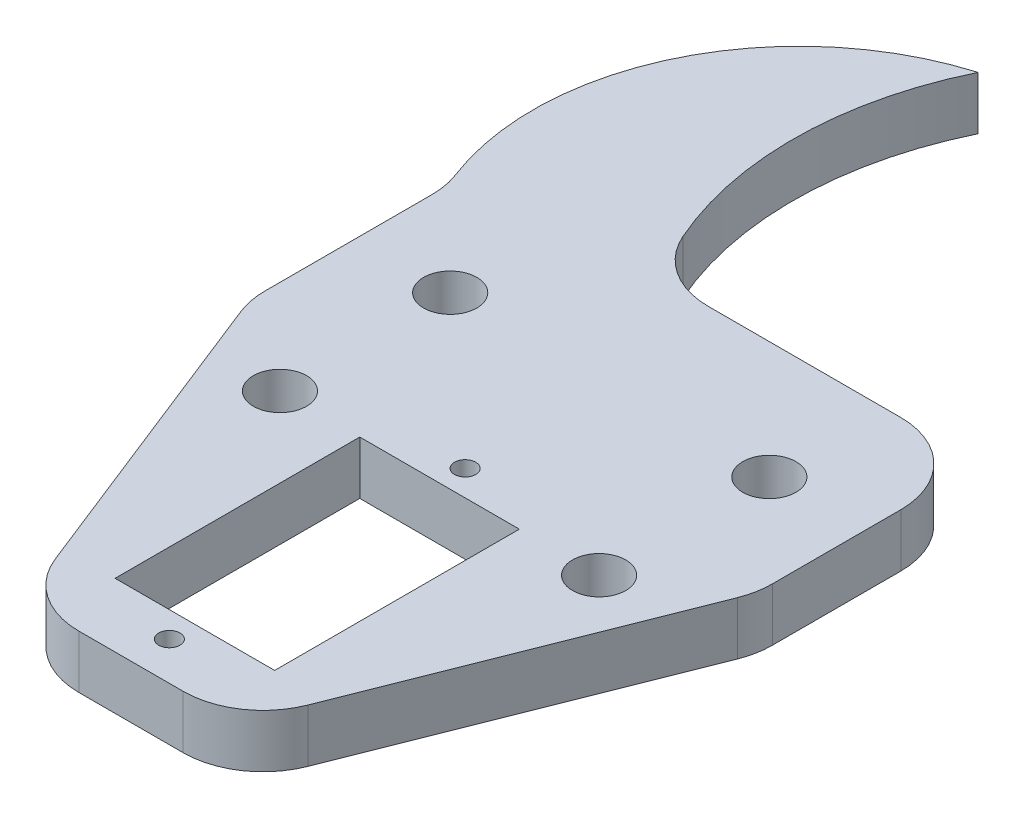
ISO-10303-21;
HEADER;
FILE_DESCRIPTION(('STEP AP214'),'2;1');
FILE_NAME('part.step','',(''),(''),'','','');
FILE_SCHEMA(('AUTOMOTIVE_DESIGN { 1 0 10303 214 1 1 1 1 }'));
ENDSEC;
DATA;
#1=APPLICATION_CONTEXT('core data for automotive mechanical design processes');
#2=APPLICATION_PROTOCOL_DEFINITION('international standard','automotive_design',2000,#1);
#3=PRODUCT_CONTEXT('',#1,'mechanical');
#4=PRODUCT('Part','Part','',(#3));
#5=PRODUCT_RELATED_PRODUCT_CATEGORY('part','',(#4));
#6=PRODUCT_DEFINITION_FORMATION('','',#4);
#7=PRODUCT_DEFINITION_CONTEXT('part definition',#1,'design');
#8=PRODUCT_DEFINITION('design','',#6,#7);
#9=PRODUCT_DEFINITION_SHAPE('','',#8);
#10=(LENGTH_UNIT() NAMED_UNIT(*) SI_UNIT(.MILLI.,.METRE.));
#11=(NAMED_UNIT(*) PLANE_ANGLE_UNIT() SI_UNIT($,.RADIAN.));
#12=(NAMED_UNIT(*) SI_UNIT($,.STERADIAN.) SOLID_ANGLE_UNIT());
#13=UNCERTAINTY_MEASURE_WITH_UNIT(LENGTH_MEASURE(1.E-05),#10,'distance_accuracy_value','');
#14=(GEOMETRIC_REPRESENTATION_CONTEXT(3) GLOBAL_UNCERTAINTY_ASSIGNED_CONTEXT((#13)) GLOBAL_UNIT_ASSIGNED_CONTEXT((#10,
#11,#12)) REPRESENTATION_CONTEXT('',''));
#15=CARTESIAN_POINT('',(0.,0.,0.));
#16=DIRECTION('',(0.,0.,1.));
#17=DIRECTION('',(1.,0.,0.));
#18=AXIS2_PLACEMENT_3D('',#15,#16,#17);
#19=CARTESIAN_POINT('',(0.,5.,0.));
#20=DIRECTION('',(0.,-1.,0.));
#21=DIRECTION('',(0.,0.,-1.));
#22=AXIS2_PLACEMENT_3D('',#19,#20,#21);
#23=CYLINDRICAL_SURFACE('',#22,25.);
#24=CARTESIAN_POINT('',(0.,0.,0.));
#25=DIRECTION('',(0.,1.,0.));
#26=DIRECTION('',(0.,0.,1.));
#27=AXIS2_PLACEMENT_3D('',#24,#25,#26);
#28=CIRCLE('',#27,25.);
#29=CARTESIAN_POINT('',(-7.13363436512248,0.,-23.9606189557938));
#30=VERTEX_POINT('',#29);
#31=CARTESIAN_POINT('',(-23.3458130599936,0.,8.94276313942358));
#32=VERTEX_POINT('',#31);
#33=EDGE_CURVE('E245',#30,#32,#28,.T.);
#34=ORIENTED_EDGE('',*,*,#33,.T.);
#35=DIRECTION('',(0.,-1.,0.));
#36=VECTOR('',#35,1.);
#37=CARTESIAN_POINT('',(-23.3458130599936,5.,8.94276313942358));
#38=LINE('',#37,#36);
#39=CARTESIAN_POINT('',(-23.3458130599936,5.,8.94276313942358));
#40=VERTEX_POINT('',#39);
#41=EDGE_CURVE('E249',#32,#40,#38,.F.);
#42=ORIENTED_EDGE('',*,*,#41,.T.);
#43=CARTESIAN_POINT('',(0.,5.,0.));
#44=DIRECTION('',(0.,1.,0.));
#45=DIRECTION('',(0.,0.,1.));
#46=AXIS2_PLACEMENT_3D('',#43,#44,#45);
#47=CIRCLE('',#46,25.);
#48=CARTESIAN_POINT('',(-7.13363436512248,5.,-23.9606189557938));
#49=VERTEX_POINT('',#48);
#50=EDGE_CURVE('E246',#49,#40,#47,.T.);
#51=ORIENTED_EDGE('',*,*,#50,.F.);
#52=DIRECTION('',(0.,1.,0.));
#53=VECTOR('',#52,1.);
#54=CARTESIAN_POINT('',(-7.13363436512248,0.,-23.9606189557938));
#55=LINE('',#54,#53);
#56=EDGE_CURVE('E241',#30,#49,#55,.T.);
#57=ORIENTED_EDGE('',*,*,#56,.F.);
#58=EDGE_LOOP('',(#34,#42,#51,#57));
#59=FACE_BOUND('',#58,.T.);
#60=ADVANCED_FACE('F36',(#59),#23,.T.);
#61=CARTESIAN_POINT('',(22.0649112171784,0.,-9.7955162808368));
#62=DIRECTION('',(0.,1.,0.));
#63=DIRECTION('',(0.,0.,1.));
#64=AXIS2_PLACEMENT_3D('',#61,#62,#63);
#65=CYLINDRICAL_SURFACE('',#64,32.4531230841313);
#66=CARTESIAN_POINT('',(22.0649112171784,5.,-9.7955162808368));
#67=DIRECTION('',(0.,1.,0.));
#68=DIRECTION('',(0.,0.,1.));
#69=AXIS2_PLACEMENT_3D('',#66,#67,#68);
#70=CIRCLE('',#69,32.4531230841313);
#71=CARTESIAN_POINT('',(-7.63456201807516,5.,3.28678043886165));
#72=VERTEX_POINT('',#71);
#73=EDGE_CURVE('E230',#49,#72,#70,.T.);
#74=ORIENTED_EDGE('',*,*,#73,.T.);
#75=DIRECTION('',(0.,1.,0.));
#76=VECTOR('',#75,1.);
#77=CARTESIAN_POINT('',(-7.63456201807516,0.,3.28678043886166));
#78=LINE('',#77,#76);
#79=CARTESIAN_POINT('',(-7.63456201807516,0.,3.28678043886165));
#80=VERTEX_POINT('',#79);
#81=EDGE_CURVE('E302',#72,#80,#78,.F.);
#82=ORIENTED_EDGE('',*,*,#81,.T.);
#83=CARTESIAN_POINT('',(22.0649112171784,0.,-9.7955162808368));
#84=DIRECTION('',(0.,1.,0.));
#85=DIRECTION('',(0.,0.,1.));
#86=AXIS2_PLACEMENT_3D('',#83,#84,#85);
#87=CIRCLE('',#86,32.4531230841313);
#88=EDGE_CURVE('E238',#30,#80,#87,.T.);
#89=ORIENTED_EDGE('',*,*,#88,.F.);
#90=ORIENTED_EDGE('',*,*,#56,.T.);
#91=EDGE_LOOP('',(#74,#82,#89,#90));
#92=FACE_BOUND('',#91,.T.);
#93=ADVANCED_FACE('F318',(#92),#65,.F.);
#94=CARTESIAN_POINT('',(0.,5.,0.));
#95=DIRECTION('',(0.,1.,0.));
#96=DIRECTION('',(0.,0.,1.));
#97=AXIS2_PLACEMENT_3D('',#94,#95,#96);
#98=PLANE('',#97);
#99=CARTESIAN_POINT('',(-14.0045438182928,5.,34.7824208251933));
#100=DIRECTION('',(0.,1.,0.));
#101=DIRECTION('',(0.,0.,-1.));
#102=AXIS2_PLACEMENT_3D('',#99,#100,#101);
#103=CIRCLE('',#102,2.5);
#104=CARTESIAN_POINT('',(-14.0045438182928,5.,32.2824208251933));
#105=VERTEX_POINT('',#104);
#106=EDGE_CURVE('E658',#105,#105,#103,.T.);
#107=ORIENTED_EDGE('',*,*,#106,.F.);
#108=EDGE_LOOP('',(#107));
#109=FACE_BOUND('',#108,.T.);
#110=CARTESIAN_POINT('',(15.9954561817072,5.,18.7824208251933));
#111=DIRECTION('',(0.,1.,0.));
#112=DIRECTION('',(0.,0.,-1.));
#113=AXIS2_PLACEMENT_3D('',#110,#111,#112);
#114=CIRCLE('',#113,2.5);
#115=CARTESIAN_POINT('',(15.9954561817072,5.,16.2824208251933));
#116=VERTEX_POINT('',#115);
#117=EDGE_CURVE('E670',#116,#116,#114,.T.);
#118=ORIENTED_EDGE('',*,*,#117,.F.);
#119=EDGE_LOOP('',(#118));
#120=FACE_BOUND('',#119,.T.);
#121=CARTESIAN_POINT('',(-14.0045438182928,5.,18.7824208251933));
#122=DIRECTION('',(0.,1.,0.));
#123=DIRECTION('',(0.,0.,1.));
#124=AXIS2_PLACEMENT_3D('',#121,#122,#123);
#125=CIRCLE('',#124,2.5);
#126=CARTESIAN_POINT('',(-14.0045438182928,5.,21.2824208251933));
#127=VERTEX_POINT('',#126);
#128=EDGE_CURVE('E665',#127,#127,#125,.T.);
#129=ORIENTED_EDGE('',*,*,#128,.F.);
#130=EDGE_LOOP('',(#129));
#131=FACE_BOUND('',#130,.T.);
#132=CARTESIAN_POINT('',(15.9954561817072,5.,34.7824208251933));
#133=DIRECTION('',(0.,1.,0.));
#134=DIRECTION('',(0.,0.,1.));
#135=AXIS2_PLACEMENT_3D('',#132,#133,#134);
#136=CIRCLE('',#135,2.5);
#137=CARTESIAN_POINT('',(15.9954561817072,5.,37.2824208251933));
#138=VERTEX_POINT('',#137);
#139=EDGE_CURVE('E357',#138,#138,#136,.T.);
#140=ORIENTED_EDGE('',*,*,#139,.F.);
#141=EDGE_LOOP('',(#140));
#142=FACE_BOUND('',#141,.T.);
#143=DIRECTION('',(0.,0.,-1.));
#144=VECTOR('',#143,1.);
#145=CARTESIAN_POINT('',(-22.8495569779917,5.,0.));
#146=LINE('',#145,#144);
#147=CARTESIAN_POINT('',(-22.8495569779917,5.,27.3529161886198));
#148=VERTEX_POINT('',#147);
#149=CARTESIAN_POINT('',(-22.8495569779917,5.,11.6255920812507));
#150=VERTEX_POINT('',#149);
#151=EDGE_CURVE('E217',#148,#150,#146,.T.);
#152=ORIENTED_EDGE('',*,*,#151,.F.);
#153=CARTESIAN_POINT('',(-15.3495569779917,5.,27.3529161886198));
#154=DIRECTION('',(0.,1.,0.));
#155=DIRECTION('',(0.,0.,1.));
#156=AXIS2_PLACEMENT_3D('',#153,#154,#155);
#157=CIRCLE('',#156,7.5);
#158=CARTESIAN_POINT('',(-22.3237305777452,5.,30.1117026248088));
#159=VERTEX_POINT('',#158);
#160=EDGE_CURVE('E267',#148,#159,#157,.T.);
#161=ORIENTED_EDGE('',*,*,#160,.T.);
#162=DIRECTION('',(0.367838191491859,0.,0.929889813300478));
#163=VECTOR('',#162,1.);
#164=CARTESIAN_POINT('',(-29.6028970463062,5.,11.7100714048949));
#165=LINE('',#164,#163);
#166=CARTESIAN_POINT('',(-10.8800342235473,5.,59.0412072613822));
#167=VERTEX_POINT('',#166);
#168=EDGE_CURVE('E348',#159,#167,#165,.T.);
#169=ORIENTED_EDGE('',*,*,#168,.T.);
#170=CARTESIAN_POINT('',(-3.90586062379368,5.,56.2824208251933));
#171=DIRECTION('',(0.,1.,0.));
#172=DIRECTION('',(0.,0.,1.));
#173=AXIS2_PLACEMENT_3D('',#170,#171,#172);
#174=CIRCLE('',#173,7.5);
#175=CARTESIAN_POINT('',(-3.90586062379368,5.,63.7824208251933));
#176=VERTEX_POINT('',#175);
#177=EDGE_CURVE('E263',#167,#176,#174,.T.);
#178=ORIENTED_EDGE('',*,*,#177,.T.);
#179=DIRECTION('',(1.,0.,0.));
#180=VECTOR('',#179,1.);
#181=CARTESIAN_POINT('',(-9.00454381829278,5.,63.7824208251933));
#182=LINE('',#181,#180);
#183=CARTESIAN_POINT('',(5.89677298720811,5.,63.7824208251933));
#184=VERTEX_POINT('',#183);
#185=EDGE_CURVE('E211',#176,#184,#182,.T.);
#186=ORIENTED_EDGE('',*,*,#185,.T.);
#187=CARTESIAN_POINT('',(5.89677298720811,5.,56.2824208251933));
#188=DIRECTION('',(0.,1.,0.));
#189=DIRECTION('',(0.,0.,1.));
#190=AXIS2_PLACEMENT_3D('',#187,#188,#189);
#191=CIRCLE('',#190,7.5);
#192=CARTESIAN_POINT('',(12.8709465869617,5.,59.0412072613822));
#193=VERTEX_POINT('',#192);
#194=EDGE_CURVE('E265',#184,#193,#191,.T.);
#195=ORIENTED_EDGE('',*,*,#194,.T.);
#196=DIRECTION('',(0.367838191491859,0.,-0.929889813300479));
#197=VECTOR('',#196,1.);
#198=CARTESIAN_POINT('',(31.3244291415592,5.,12.3910609624269));
#199=LINE('',#198,#197);
#200=CARTESIAN_POINT('',(24.3146429411597,5.,30.1117026248087));
#201=VERTEX_POINT('',#200);
#202=EDGE_CURVE('E349',#193,#201,#199,.T.);
#203=ORIENTED_EDGE('',*,*,#202,.T.);
#204=CARTESIAN_POINT('',(17.3404693414061,5.,27.3529161886198));
#205=DIRECTION('',(0.,1.,0.));
#206=DIRECTION('',(0.,0.,1.));
#207=AXIS2_PLACEMENT_3D('',#204,#205,#206);
#208=CIRCLE('',#207,7.5);
#209=CARTESIAN_POINT('',(24.8404693414061,5.,27.3529161886198));
#210=VERTEX_POINT('',#209);
#211=EDGE_CURVE('E261',#201,#210,#208,.T.);
#212=ORIENTED_EDGE('',*,*,#211,.T.);
#213=DIRECTION('',(0.,0.,1.));
#214=VECTOR('',#213,1.);
#215=CARTESIAN_POINT('',(24.8404693414061,5.,0.));
#216=LINE('',#215,#214);
#217=CARTESIAN_POINT('',(24.8404693414061,5.,15.2634281056092));
#218=VERTEX_POINT('',#217);
#219=EDGE_CURVE('E233',#218,#210,#216,.T.);
#220=ORIENTED_EDGE('',*,*,#219,.F.);
#221=CARTESIAN_POINT('',(17.3404693414061,5.,15.2634281056092));
#222=DIRECTION('',(0.,1.,0.));
#223=DIRECTION('',(0.,0.,1.));
#224=AXIS2_PLACEMENT_3D('',#221,#222,#223);
#225=CIRCLE('',#224,7.5);
#226=CARTESIAN_POINT('',(17.3404693414061,5.,7.76342810560916));
#227=VERTEX_POINT('',#226);
#228=EDGE_CURVE('E259',#218,#227,#225,.T.);
#229=ORIENTED_EDGE('',*,*,#228,.T.);
#230=DIRECTION('',(1.,0.,0.));
#231=VECTOR('',#230,1.);
#232=CARTESIAN_POINT('',(0.,5.,7.76342810560917));
#233=LINE('',#232,#231);
#234=CARTESIAN_POINT('',(-0.770937562365419,5.,7.76342810560917));
#235=VERTEX_POINT('',#234);
#236=EDGE_CURVE('E224',#235,#227,#233,.T.);
#237=ORIENTED_EDGE('',*,*,#236,.F.);
#238=CARTESIAN_POINT('',(-0.770937562365421,5.,0.263428105609169));
#239=DIRECTION('',(0.,1.,0.));
#240=DIRECTION('',(0.,0.,1.));
#241=AXIS2_PLACEMENT_3D('',#238,#239,#240);
#242=CIRCLE('',#241,7.5);
#243=EDGE_CURVE('E44',#235,#72,#242,.F.);
#244=ORIENTED_EDGE('',*,*,#243,.T.);
#245=ORIENTED_EDGE('',*,*,#73,.F.);
#246=ORIENTED_EDGE('',*,*,#50,.T.);
#247=CARTESIAN_POINT('',(-30.3495569779917,5.,11.6255920812507));
#248=DIRECTION('',(0.,1.,0.));
#249=DIRECTION('',(0.,0.,1.));
#250=AXIS2_PLACEMENT_3D('',#247,#248,#249);
#251=CIRCLE('',#250,7.5);
#252=EDGE_CURVE('E304',#40,#150,#251,.F.);
#253=ORIENTED_EDGE('',*,*,#252,.T.);
#254=EDGE_LOOP('',(#152,#161,#169,#178,#186,#195,#203,#212,#220,#229,#237,#244,#245,#246,#253));
#255=FACE_BOUND('',#254,.T.);
#256=CARTESIAN_POINT('',(0.995456181707223,5.,32.3824208251933));
#257=DIRECTION('',(0.,1.,0.));
#258=DIRECTION('',(0.,0.,-1.));
#259=AXIS2_PLACEMENT_3D('',#256,#257,#258);
#260=CIRCLE('',#259,1.);
#261=CARTESIAN_POINT('',(0.995456181707223,5.,31.3824208251933));
#262=VERTEX_POINT('',#261);
#263=EDGE_CURVE('E361',#262,#262,#260,.T.);
#264=ORIENTED_EDGE('',*,*,#263,.F.);
#265=EDGE_LOOP('',(#264));
#266=FACE_BOUND('',#265,.T.);
#267=CARTESIAN_POINT('',(0.995456181707223,5.,60.1824208251933));
#268=DIRECTION('',(0.,1.,0.));
#269=DIRECTION('',(0.,0.,1.));
#270=AXIS2_PLACEMENT_3D('',#267,#268,#269);
#271=CIRCLE('',#270,1.);
#272=CARTESIAN_POINT('',(0.995456181707223,5.,61.1824208251933));
#273=VERTEX_POINT('',#272);
#274=EDGE_CURVE('E198',#273,#273,#271,.T.);
#275=ORIENTED_EDGE('',*,*,#274,.F.);
#276=EDGE_LOOP('',(#275));
#277=FACE_BOUND('',#276,.T.);
#278=DIRECTION('',(-1.,0.,0.));
#279=VECTOR('',#278,1.);
#280=CARTESIAN_POINT('',(-6.50454381829278,5.,34.7824208251933));
#281=LINE('',#280,#279);
#282=CARTESIAN_POINT('',(8.49545618170722,5.,34.7824208251933));
#283=VERTEX_POINT('',#282);
#284=CARTESIAN_POINT('',(-6.50454381829278,5.,34.7824208251933));
#285=VERTEX_POINT('',#284);
#286=EDGE_CURVE('E204',#283,#285,#281,.T.);
#287=ORIENTED_EDGE('',*,*,#286,.F.);
#288=DIRECTION('',(0.,0.,-1.));
#289=VECTOR('',#288,1.);
#290=CARTESIAN_POINT('',(8.49545618170722,5.,57.7824208251933));
#291=LINE('',#290,#289);
#292=CARTESIAN_POINT('',(8.49545618170722,5.,57.7824208251933));
#293=VERTEX_POINT('',#292);
#294=EDGE_CURVE('E175',#293,#283,#291,.T.);
#295=ORIENTED_EDGE('',*,*,#294,.F.);
#296=DIRECTION('',(1.,0.,0.));
#297=VECTOR('',#296,1.);
#298=CARTESIAN_POINT('',(-6.50454381829278,5.,57.7824208251933));
#299=LINE('',#298,#297);
#300=CARTESIAN_POINT('',(-6.50454381829278,5.,57.7824208251933));
#301=VERTEX_POINT('',#300);
#302=EDGE_CURVE('E192',#301,#293,#299,.T.);
#303=ORIENTED_EDGE('',*,*,#302,.F.);
#304=DIRECTION('',(0.,0.,1.));
#305=VECTOR('',#304,1.);
#306=CARTESIAN_POINT('',(-6.50454381829278,5.,57.7824208251933));
#307=LINE('',#306,#305);
#308=EDGE_CURVE('E195',#285,#301,#307,.T.);
#309=ORIENTED_EDGE('',*,*,#308,.F.);
#310=EDGE_LOOP('',(#287,#295,#303,#309));
#311=FACE_BOUND('',#310,.T.);
#312=ADVANCED_FACE('F311',(#109,#120,#131,#142,#255,#266,#277,#311),#98,.T.);
#313=CARTESIAN_POINT('',(0.,0.,0.));
#314=DIRECTION('',(0.,1.,0.));
#315=DIRECTION('',(0.,0.,1.));
#316=AXIS2_PLACEMENT_3D('',#313,#314,#315);
#317=PLANE('',#316);
#318=CARTESIAN_POINT('',(-14.0045438182928,0.,34.7824208251933));
#319=DIRECTION('',(0.,1.,0.));
#320=DIRECTION('',(0.,0.,-1.));
#321=AXIS2_PLACEMENT_3D('',#318,#319,#320);
#322=CIRCLE('',#321,2.5);
#323=CARTESIAN_POINT('',(-14.0045438182928,0.,32.2824208251933));
#324=VERTEX_POINT('',#323);
#325=EDGE_CURVE('E656',#324,#324,#322,.T.);
#326=ORIENTED_EDGE('',*,*,#325,.T.);
#327=EDGE_LOOP('',(#326));
#328=FACE_BOUND('',#327,.T.);
#329=CARTESIAN_POINT('',(15.9954561817072,0.,18.7824208251933));
#330=DIRECTION('',(0.,1.,0.));
#331=DIRECTION('',(0.,0.,-1.));
#332=AXIS2_PLACEMENT_3D('',#329,#330,#331);
#333=CIRCLE('',#332,2.5);
#334=CARTESIAN_POINT('',(15.9954561817072,0.,16.2824208251933));
#335=VERTEX_POINT('',#334);
#336=EDGE_CURVE('E662',#335,#335,#333,.T.);
#337=ORIENTED_EDGE('',*,*,#336,.T.);
#338=EDGE_LOOP('',(#337));
#339=FACE_BOUND('',#338,.T.);
#340=CARTESIAN_POINT('',(-14.0045438182928,0.,18.7824208251933));
#341=DIRECTION('',(0.,1.,0.));
#342=DIRECTION('',(0.,0.,1.));
#343=AXIS2_PLACEMENT_3D('',#340,#341,#342);
#344=CIRCLE('',#343,2.5);
#345=CARTESIAN_POINT('',(-14.0045438182928,0.,21.2824208251933));
#346=VERTEX_POINT('',#345);
#347=EDGE_CURVE('E672',#346,#346,#344,.T.);
#348=ORIENTED_EDGE('',*,*,#347,.T.);
#349=EDGE_LOOP('',(#348));
#350=FACE_BOUND('',#349,.T.);
#351=CARTESIAN_POINT('',(15.9954561817072,0.,34.7824208251933));
#352=DIRECTION('',(0.,1.,0.));
#353=DIRECTION('',(0.,0.,1.));
#354=AXIS2_PLACEMENT_3D('',#351,#352,#353);
#355=CIRCLE('',#354,2.5);
#356=CARTESIAN_POINT('',(15.9954561817072,0.,37.2824208251933));
#357=VERTEX_POINT('',#356);
#358=EDGE_CURVE('E354',#357,#357,#355,.T.);
#359=ORIENTED_EDGE('',*,*,#358,.T.);
#360=EDGE_LOOP('',(#359));
#361=FACE_BOUND('',#360,.T.);
#362=DIRECTION('',(0.367838191491859,0.,0.929889813300478));
#363=VECTOR('',#362,1.);
#364=CARTESIAN_POINT('',(-29.6028970463062,0.,11.7100714048949));
#365=LINE('',#364,#363);
#366=CARTESIAN_POINT('',(-22.3237305777452,0.,30.1117026248088));
#367=VERTEX_POINT('',#366);
#368=CARTESIAN_POINT('',(-10.8800342235473,0.,59.0412072613822));
#369=VERTEX_POINT('',#368);
#370=EDGE_CURVE('E352',#367,#369,#365,.T.);
#371=ORIENTED_EDGE('',*,*,#370,.F.);
#372=CARTESIAN_POINT('',(-15.3495569779917,0.,27.3529161886198));
#373=DIRECTION('',(0.,1.,0.));
#374=DIRECTION('',(0.,0.,1.));
#375=AXIS2_PLACEMENT_3D('',#372,#373,#374);
#376=CIRCLE('',#375,7.5);
#377=CARTESIAN_POINT('',(-22.8495569779917,0.,27.3529161886198));
#378=VERTEX_POINT('',#377);
#379=EDGE_CURVE('E281',#367,#378,#376,.F.);
#380=ORIENTED_EDGE('',*,*,#379,.T.);
#381=DIRECTION('',(0.,0.,-1.));
#382=VECTOR('',#381,1.);
#383=CARTESIAN_POINT('',(-22.8495569779917,0.,0.));
#384=LINE('',#383,#382);
#385=CARTESIAN_POINT('',(-22.8495569779917,0.,11.6255920812507));
#386=VERTEX_POINT('',#385);
#387=EDGE_CURVE('E220',#378,#386,#384,.T.);
#388=ORIENTED_EDGE('',*,*,#387,.T.);
#389=CARTESIAN_POINT('',(-30.3495569779917,0.,11.6255920812507));
#390=DIRECTION('',(0.,1.,0.));
#391=DIRECTION('',(0.,0.,1.));
#392=AXIS2_PLACEMENT_3D('',#389,#390,#391);
#393=CIRCLE('',#392,7.5);
#394=EDGE_CURVE('E306',#386,#32,#393,.T.);
#395=ORIENTED_EDGE('',*,*,#394,.T.);
#396=ORIENTED_EDGE('',*,*,#33,.F.);
#397=ORIENTED_EDGE('',*,*,#88,.T.);
#398=CARTESIAN_POINT('',(-0.770937562365421,0.,0.263428105609169));
#399=DIRECTION('',(0.,1.,0.));
#400=DIRECTION('',(0.,0.,1.));
#401=AXIS2_PLACEMENT_3D('',#398,#399,#400);
#402=CIRCLE('',#401,7.5);
#403=CARTESIAN_POINT('',(-0.770937562365419,0.,7.76342810560917));
#404=VERTEX_POINT('',#403);
#405=EDGE_CURVE('E11',#80,#404,#402,.T.);
#406=ORIENTED_EDGE('',*,*,#405,.T.);
#407=DIRECTION('',(1.,0.,0.));
#408=VECTOR('',#407,1.);
#409=CARTESIAN_POINT('',(0.,0.,7.76342810560917));
#410=LINE('',#409,#408);
#411=CARTESIAN_POINT('',(17.3404693414061,0.,7.76342810560916));
#412=VERTEX_POINT('',#411);
#413=EDGE_CURVE('E227',#404,#412,#410,.T.);
#414=ORIENTED_EDGE('',*,*,#413,.T.);
#415=CARTESIAN_POINT('',(17.3404693414061,0.,15.2634281056092));
#416=DIRECTION('',(0.,1.,0.));
#417=DIRECTION('',(0.,0.,1.));
#418=AXIS2_PLACEMENT_3D('',#415,#416,#417);
#419=CIRCLE('',#418,7.5);
#420=CARTESIAN_POINT('',(24.8404693414061,0.,15.2634281056092));
#421=VERTEX_POINT('',#420);
#422=EDGE_CURVE('E274',#412,#421,#419,.F.);
#423=ORIENTED_EDGE('',*,*,#422,.T.);
#424=DIRECTION('',(0.,0.,1.));
#425=VECTOR('',#424,1.);
#426=CARTESIAN_POINT('',(24.8404693414061,0.,0.));
#427=LINE('',#426,#425);
#428=CARTESIAN_POINT('',(24.8404693414061,0.,27.3529161886198));
#429=VERTEX_POINT('',#428);
#430=EDGE_CURVE('E223',#421,#429,#427,.T.);
#431=ORIENTED_EDGE('',*,*,#430,.T.);
#432=CARTESIAN_POINT('',(17.3404693414061,0.,27.3529161886198));
#433=DIRECTION('',(0.,1.,0.));
#434=DIRECTION('',(0.,0.,1.));
#435=AXIS2_PLACEMENT_3D('',#432,#433,#434);
#436=CIRCLE('',#435,7.5);
#437=CARTESIAN_POINT('',(24.3146429411597,0.,30.1117026248087));
#438=VERTEX_POINT('',#437);
#439=EDGE_CURVE('E276',#429,#438,#436,.F.);
#440=ORIENTED_EDGE('',*,*,#439,.T.);
#441=DIRECTION('',(0.367838191491859,0.,-0.929889813300479));
#442=VECTOR('',#441,1.);
#443=CARTESIAN_POINT('',(31.3244291415592,0.,12.3910609624269));
#444=LINE('',#443,#442);
#445=CARTESIAN_POINT('',(12.8709465869617,0.,59.0412072613822));
#446=VERTEX_POINT('',#445);
#447=EDGE_CURVE('E342',#446,#438,#444,.T.);
#448=ORIENTED_EDGE('',*,*,#447,.F.);
#449=CARTESIAN_POINT('',(5.89677298720811,0.,56.2824208251933));
#450=DIRECTION('',(0.,1.,0.));
#451=DIRECTION('',(0.,0.,1.));
#452=AXIS2_PLACEMENT_3D('',#449,#450,#451);
#453=CIRCLE('',#452,7.5);
#454=CARTESIAN_POINT('',(5.89677298720811,0.,63.7824208251933));
#455=VERTEX_POINT('',#454);
#456=EDGE_CURVE('E51',#446,#455,#453,.F.);
#457=ORIENTED_EDGE('',*,*,#456,.T.);
#458=DIRECTION('',(1.,0.,0.));
#459=VECTOR('',#458,1.);
#460=CARTESIAN_POINT('',(-9.00454381829278,0.,63.7824208251933));
#461=LINE('',#460,#459);
#462=CARTESIAN_POINT('',(-3.90586062379368,0.,63.7824208251933));
#463=VERTEX_POINT('',#462);
#464=EDGE_CURVE('E215',#463,#455,#461,.T.);
#465=ORIENTED_EDGE('',*,*,#464,.F.);
#466=CARTESIAN_POINT('',(-3.90586062379368,0.,56.2824208251933));
#467=DIRECTION('',(0.,1.,0.));
#468=DIRECTION('',(0.,0.,1.));
#469=AXIS2_PLACEMENT_3D('',#466,#467,#468);
#470=CIRCLE('',#469,7.5);
#471=EDGE_CURVE('E278',#463,#369,#470,.F.);
#472=ORIENTED_EDGE('',*,*,#471,.T.);
#473=EDGE_LOOP('',(#371,#380,#388,#395,#396,#397,#406,#414,#423,#431,#440,#448,#457,#465,#472));
#474=FACE_BOUND('',#473,.T.);
#475=CARTESIAN_POINT('',(0.995456181707223,0.,32.3824208251933));
#476=DIRECTION('',(0.,1.,0.));
#477=DIRECTION('',(0.,0.,-1.));
#478=AXIS2_PLACEMENT_3D('',#475,#476,#477);
#479=CIRCLE('',#478,1.);
#480=CARTESIAN_POINT('',(0.995456181707223,0.,31.3824208251933));
#481=VERTEX_POINT('',#480);
#482=EDGE_CURVE('E363',#481,#481,#479,.T.);
#483=ORIENTED_EDGE('',*,*,#482,.T.);
#484=EDGE_LOOP('',(#483));
#485=FACE_BOUND('',#484,.T.);
#486=CARTESIAN_POINT('',(0.995456181707223,0.,60.1824208251933));
#487=DIRECTION('',(0.,1.,0.));
#488=DIRECTION('',(0.,0.,1.));
#489=AXIS2_PLACEMENT_3D('',#486,#487,#488);
#490=CIRCLE('',#489,1.);
#491=CARTESIAN_POINT('',(0.995456181707223,0.,61.1824208251933));
#492=VERTEX_POINT('',#491);
#493=EDGE_CURVE('E205',#492,#492,#490,.T.);
#494=ORIENTED_EDGE('',*,*,#493,.T.);
#495=EDGE_LOOP('',(#494));
#496=FACE_BOUND('',#495,.T.);
#497=DIRECTION('',(0.,0.,-1.));
#498=VECTOR('',#497,1.);
#499=CARTESIAN_POINT('',(8.49545618170722,0.,57.7824208251933));
#500=LINE('',#499,#498);
#501=CARTESIAN_POINT('',(8.49545618170722,0.,57.7824208251933));
#502=VERTEX_POINT('',#501);
#503=CARTESIAN_POINT('',(8.49545618170722,0.,34.7824208251933));
#504=VERTEX_POINT('',#503);
#505=EDGE_CURVE('E172',#502,#504,#500,.T.);
#506=ORIENTED_EDGE('',*,*,#505,.T.);
#507=DIRECTION('',(-1.,0.,0.));
#508=VECTOR('',#507,1.);
#509=CARTESIAN_POINT('',(-6.50454381829278,0.,34.7824208251933));
#510=LINE('',#509,#508);
#511=CARTESIAN_POINT('',(-6.50454381829278,0.,34.7824208251933));
#512=VERTEX_POINT('',#511);
#513=EDGE_CURVE('E184',#504,#512,#510,.T.);
#514=ORIENTED_EDGE('',*,*,#513,.T.);
#515=DIRECTION('',(0.,0.,1.));
#516=VECTOR('',#515,1.);
#517=CARTESIAN_POINT('',(-6.50454381829278,0.,57.7824208251933));
#518=LINE('',#517,#516);
#519=CARTESIAN_POINT('',(-6.50454381829278,0.,57.7824208251933));
#520=VERTEX_POINT('',#519);
#521=EDGE_CURVE('E188',#512,#520,#518,.T.);
#522=ORIENTED_EDGE('',*,*,#521,.T.);
#523=DIRECTION('',(1.,0.,0.));
#524=VECTOR('',#523,1.);
#525=CARTESIAN_POINT('',(-6.50454381829278,0.,57.7824208251933));
#526=LINE('',#525,#524);
#527=EDGE_CURVE('E180',#520,#502,#526,.T.);
#528=ORIENTED_EDGE('',*,*,#527,.T.);
#529=EDGE_LOOP('',(#506,#514,#522,#528));
#530=FACE_BOUND('',#529,.T.);
#531=ADVANCED_FACE('F190',(#328,#339,#350,#361,#474,#485,#496,#530),#317,.F.);
#532=CARTESIAN_POINT('',(-22.8495569779917,0.,0.));
#533=DIRECTION('',(1.,0.,0.));
#534=DIRECTION('',(0.,0.,-1.));
#535=AXIS2_PLACEMENT_3D('',#532,#533,#534);
#536=PLANE('',#535);
#537=ORIENTED_EDGE('',*,*,#151,.T.);
#538=DIRECTION('',(0.,1.,0.));
#539=VECTOR('',#538,1.);
#540=CARTESIAN_POINT('',(-22.8495569779917,0.,11.6255920812507));
#541=LINE('',#540,#539);
#542=EDGE_CURVE('E257',#150,#386,#541,.F.);
#543=ORIENTED_EDGE('',*,*,#542,.T.);
#544=ORIENTED_EDGE('',*,*,#387,.F.);
#545=DIRECTION('',(0.,1.,0.));
#546=VECTOR('',#545,1.);
#547=CARTESIAN_POINT('',(-22.8495569779917,5.,27.3529161886198));
#548=LINE('',#547,#546);
#549=EDGE_CURVE('E254',#378,#148,#548,.T.);
#550=ORIENTED_EDGE('',*,*,#549,.T.);
#551=EDGE_LOOP('',(#537,#543,#544,#550));
#552=FACE_BOUND('',#551,.T.);
#553=ADVANCED_FACE('F516',(#552),#536,.F.);
#554=CARTESIAN_POINT('',(0.,0.,7.76342810560917));
#555=DIRECTION('',(0.,0.,1.));
#556=DIRECTION('',(1.,0.,0.));
#557=AXIS2_PLACEMENT_3D('',#554,#555,#556);
#558=PLANE('',#557);
#559=ORIENTED_EDGE('',*,*,#236,.T.);
#560=DIRECTION('',(0.,1.,0.));
#561=VECTOR('',#560,1.);
#562=CARTESIAN_POINT('',(17.3404693414061,0.,7.76342810560916));
#563=LINE('',#562,#561);
#564=EDGE_CURVE('E300',#227,#412,#563,.F.);
#565=ORIENTED_EDGE('',*,*,#564,.T.);
#566=ORIENTED_EDGE('',*,*,#413,.F.);
#567=DIRECTION('',(0.,-1.,0.));
#568=VECTOR('',#567,1.);
#569=CARTESIAN_POINT('',(-0.770937562365419,5.,7.76342810560917));
#570=LINE('',#569,#568);
#571=EDGE_CURVE('E297',#404,#235,#570,.F.);
#572=ORIENTED_EDGE('',*,*,#571,.T.);
#573=EDGE_LOOP('',(#559,#565,#566,#572));
#574=FACE_BOUND('',#573,.T.);
#575=ADVANCED_FACE('F327',(#574),#558,.F.);
#576=CARTESIAN_POINT('',(24.8404693414061,0.,0.));
#577=DIRECTION('',(-1.,0.,0.));
#578=DIRECTION('',(0.,0.,1.));
#579=AXIS2_PLACEMENT_3D('',#576,#577,#578);
#580=PLANE('',#579);
#581=ORIENTED_EDGE('',*,*,#219,.T.);
#582=DIRECTION('',(0.,1.,0.));
#583=VECTOR('',#582,1.);
#584=CARTESIAN_POINT('',(24.8404693414061,0.,27.3529161886198));
#585=LINE('',#584,#583);
#586=EDGE_CURVE('E295',#210,#429,#585,.F.);
#587=ORIENTED_EDGE('',*,*,#586,.T.);
#588=ORIENTED_EDGE('',*,*,#430,.F.);
#589=DIRECTION('',(0.,1.,0.));
#590=VECTOR('',#589,1.);
#591=CARTESIAN_POINT('',(24.8404693414061,0.,15.2634281056092));
#592=LINE('',#591,#590);
#593=EDGE_CURVE('E292',#421,#218,#592,.T.);
#594=ORIENTED_EDGE('',*,*,#593,.T.);
#595=EDGE_LOOP('',(#581,#587,#588,#594));
#596=FACE_BOUND('',#595,.T.);
#597=ADVANCED_FACE('F335',(#596),#580,.F.);
#598=CARTESIAN_POINT('',(-9.00454381829278,0.,63.7824208251933));
#599=DIRECTION('',(0.,0.,1.));
#600=DIRECTION('',(1.,0.,0.));
#601=AXIS2_PLACEMENT_3D('',#598,#599,#600);
#602=PLANE('',#601);
#603=ORIENTED_EDGE('',*,*,#464,.T.);
#604=DIRECTION('',(0.,1.,0.));
#605=VECTOR('',#604,1.);
#606=CARTESIAN_POINT('',(5.89677298720811,0.,63.7824208251933));
#607=LINE('',#606,#605);
#608=EDGE_CURVE('E284',#455,#184,#607,.T.);
#609=ORIENTED_EDGE('',*,*,#608,.T.);
#610=ORIENTED_EDGE('',*,*,#185,.F.);
#611=DIRECTION('',(0.,1.,0.));
#612=VECTOR('',#611,1.);
#613=CARTESIAN_POINT('',(-3.90586062379368,0.,63.7824208251933));
#614=LINE('',#613,#612);
#615=EDGE_CURVE('E58',#176,#463,#614,.F.);
#616=ORIENTED_EDGE('',*,*,#615,.T.);
#617=EDGE_LOOP('',(#603,#609,#610,#616));
#618=FACE_BOUND('',#617,.T.);
#619=ADVANCED_FACE('F392',(#618),#602,.T.);
#620=CARTESIAN_POINT('',(8.49545618170722,0.,57.7824208251933));
#621=DIRECTION('',(1.,0.,0.));
#622=DIRECTION('',(0.,0.,-1.));
#623=AXIS2_PLACEMENT_3D('',#620,#621,#622);
#624=PLANE('',#623);
#625=ORIENTED_EDGE('',*,*,#294,.T.);
#626=DIRECTION('',(0.,1.,0.));
#627=VECTOR('',#626,1.);
#628=CARTESIAN_POINT('',(8.49545618170722,0.,34.7824208251933));
#629=LINE('',#628,#627);
#630=EDGE_CURVE('E168',#504,#283,#629,.T.);
#631=ORIENTED_EDGE('',*,*,#630,.F.);
#632=ORIENTED_EDGE('',*,*,#505,.F.);
#633=DIRECTION('',(0.,1.,0.));
#634=VECTOR('',#633,1.);
#635=CARTESIAN_POINT('',(8.49545618170722,0.,57.7824208251933));
#636=LINE('',#635,#634);
#637=EDGE_CURVE('E209',#502,#293,#636,.T.);
#638=ORIENTED_EDGE('',*,*,#637,.T.);
#639=EDGE_LOOP('',(#625,#631,#632,#638));
#640=FACE_BOUND('',#639,.T.);
#641=ADVANCED_FACE('F170',(#640),#624,.F.);
#642=CARTESIAN_POINT('',(-6.50454381829278,0.,57.7824208251933));
#643=DIRECTION('',(0.,0.,1.));
#644=DIRECTION('',(1.,0.,0.));
#645=AXIS2_PLACEMENT_3D('',#642,#643,#644);
#646=PLANE('',#645);
#647=ORIENTED_EDGE('',*,*,#302,.T.);
#648=ORIENTED_EDGE('',*,*,#637,.F.);
#649=ORIENTED_EDGE('',*,*,#527,.F.);
#650=DIRECTION('',(0.,1.,0.));
#651=VECTOR('',#650,1.);
#652=CARTESIAN_POINT('',(-6.50454381829278,0.,57.7824208251933));
#653=LINE('',#652,#651);
#654=EDGE_CURVE('E212',#520,#301,#653,.T.);
#655=ORIENTED_EDGE('',*,*,#654,.T.);
#656=EDGE_LOOP('',(#647,#648,#649,#655));
#657=FACE_BOUND('',#656,.T.);
#658=ADVANCED_FACE('F384',(#657),#646,.F.);
#659=CARTESIAN_POINT('',(-6.50454381829278,0.,57.7824208251933));
#660=DIRECTION('',(-1.,0.,0.));
#661=DIRECTION('',(0.,0.,1.));
#662=AXIS2_PLACEMENT_3D('',#659,#660,#661);
#663=PLANE('',#662);
#664=ORIENTED_EDGE('',*,*,#308,.T.);
#665=ORIENTED_EDGE('',*,*,#654,.F.);
#666=ORIENTED_EDGE('',*,*,#521,.F.);
#667=DIRECTION('',(0.,1.,0.));
#668=VECTOR('',#667,1.);
#669=CARTESIAN_POINT('',(-6.50454381829278,0.,34.7824208251933));
#670=LINE('',#669,#668);
#671=EDGE_CURVE('E179',#512,#285,#670,.T.);
#672=ORIENTED_EDGE('',*,*,#671,.T.);
#673=EDGE_LOOP('',(#664,#665,#666,#672));
#674=FACE_BOUND('',#673,.T.);
#675=ADVANCED_FACE('F382',(#674),#663,.F.);
#676=CARTESIAN_POINT('',(-6.50454381829278,0.,34.7824208251933));
#677=DIRECTION('',(0.,0.,-1.));
#678=DIRECTION('',(-1.,0.,0.));
#679=AXIS2_PLACEMENT_3D('',#676,#677,#678);
#680=PLANE('',#679);
#681=ORIENTED_EDGE('',*,*,#286,.T.);
#682=ORIENTED_EDGE('',*,*,#671,.F.);
#683=ORIENTED_EDGE('',*,*,#513,.F.);
#684=ORIENTED_EDGE('',*,*,#630,.T.);
#685=EDGE_LOOP('',(#681,#682,#683,#684));
#686=FACE_BOUND('',#685,.T.);
#687=ADVANCED_FACE('F185',(#686),#680,.F.);
#688=CARTESIAN_POINT('',(0.995456181707223,0.,60.1824208251933));
#689=DIRECTION('',(0.,1.,0.));
#690=DIRECTION('',(0.,0.,1.));
#691=AXIS2_PLACEMENT_3D('',#688,#689,#690);
#692=CYLINDRICAL_SURFACE('',#691,1.);
#693=ORIENTED_EDGE('',*,*,#493,.F.);
#694=EDGE_LOOP('',(#693));
#695=FACE_BOUND('',#694,.T.);
#696=ORIENTED_EDGE('',*,*,#274,.T.);
#697=EDGE_LOOP('',(#696));
#698=FACE_BOUND('',#697,.T.);
#699=ADVANCED_FACE('F373',(#695,#698),#692,.F.);
#700=CARTESIAN_POINT('',(0.995456181707223,0.,32.3824208251933));
#701=DIRECTION('',(0.,1.,0.));
#702=DIRECTION('',(0.,0.,1.));
#703=AXIS2_PLACEMENT_3D('',#700,#701,#702);
#704=CYLINDRICAL_SURFACE('',#703,1.);
#705=ORIENTED_EDGE('',*,*,#482,.F.);
#706=EDGE_LOOP('',(#705));
#707=FACE_BOUND('',#706,.T.);
#708=ORIENTED_EDGE('',*,*,#263,.T.);
#709=EDGE_LOOP('',(#708));
#710=FACE_BOUND('',#709,.T.);
#711=ADVANCED_FACE('F485',(#707,#710),#704,.F.);
#712=CARTESIAN_POINT('',(-29.6028970463062,0.,11.7100714048949));
#713=DIRECTION('',(-0.929889813300478,0.,0.367838191491859));
#714=DIRECTION('',(0.367838191491859,0.,0.929889813300478));
#715=AXIS2_PLACEMENT_3D('',#712,#713,#714);
#716=PLANE('',#715);
#717=ORIENTED_EDGE('',*,*,#168,.F.);
#718=DIRECTION('',(0.,1.,0.));
#719=VECTOR('',#718,1.);
#720=CARTESIAN_POINT('',(-22.3237305777452,0.,30.1117026248088));
#721=LINE('',#720,#719);
#722=EDGE_CURVE('E272',#159,#367,#721,.F.);
#723=ORIENTED_EDGE('',*,*,#722,.T.);
#724=ORIENTED_EDGE('',*,*,#370,.T.);
#725=DIRECTION('',(0.,1.,0.));
#726=VECTOR('',#725,1.);
#727=CARTESIAN_POINT('',(-10.8800342235473,0.,59.0412072613822));
#728=LINE('',#727,#726);
#729=EDGE_CURVE('E269',#369,#167,#728,.T.);
#730=ORIENTED_EDGE('',*,*,#729,.T.);
#731=EDGE_LOOP('',(#717,#723,#724,#730));
#732=FACE_BOUND('',#731,.T.);
#733=ADVANCED_FACE('F474',(#732),#716,.T.);
#734=CARTESIAN_POINT('',(31.3244291415592,0.,12.3910609624269));
#735=DIRECTION('',(0.929889813300479,0.,0.367838191491859));
#736=DIRECTION('',(0.367838191491859,0.,-0.929889813300479));
#737=AXIS2_PLACEMENT_3D('',#734,#735,#736);
#738=PLANE('',#737);
#739=ORIENTED_EDGE('',*,*,#202,.F.);
#740=DIRECTION('',(0.,1.,0.));
#741=VECTOR('',#740,1.);
#742=CARTESIAN_POINT('',(12.8709465869617,0.,59.0412072613822));
#743=LINE('',#742,#741);
#744=EDGE_CURVE('E290',#193,#446,#743,.F.);
#745=ORIENTED_EDGE('',*,*,#744,.T.);
#746=ORIENTED_EDGE('',*,*,#447,.T.);
#747=DIRECTION('',(0.,1.,0.));
#748=VECTOR('',#747,1.);
#749=CARTESIAN_POINT('',(24.3146429411597,5.,30.1117026248087));
#750=LINE('',#749,#748);
#751=EDGE_CURVE('E287',#438,#201,#750,.T.);
#752=ORIENTED_EDGE('',*,*,#751,.T.);
#753=EDGE_LOOP('',(#739,#745,#746,#752));
#754=FACE_BOUND('',#753,.T.);
#755=ADVANCED_FACE('F345',(#754),#738,.T.);
#756=CARTESIAN_POINT('',(15.9954561817072,0.,34.7824208251933));
#757=DIRECTION('',(0.,1.,0.));
#758=DIRECTION('',(0.,0.,1.));
#759=AXIS2_PLACEMENT_3D('',#756,#757,#758);
#760=CYLINDRICAL_SURFACE('',#759,2.5);
#761=ORIENTED_EDGE('',*,*,#358,.F.);
#762=EDGE_LOOP('',(#761));
#763=FACE_BOUND('',#762,.T.);
#764=ORIENTED_EDGE('',*,*,#139,.T.);
#765=EDGE_LOOP('',(#764));
#766=FACE_BOUND('',#765,.T.);
#767=ADVANCED_FACE('F473',(#763,#766),#760,.F.);
#768=CARTESIAN_POINT('',(-14.0045438182928,0.,18.7824208251933));
#769=DIRECTION('',(0.,1.,0.));
#770=DIRECTION('',(0.,0.,1.));
#771=AXIS2_PLACEMENT_3D('',#768,#769,#770);
#772=CYLINDRICAL_SURFACE('',#771,2.5);
#773=ORIENTED_EDGE('',*,*,#347,.F.);
#774=EDGE_LOOP('',(#773));
#775=FACE_BOUND('',#774,.T.);
#776=ORIENTED_EDGE('',*,*,#128,.T.);
#777=EDGE_LOOP('',(#776));
#778=FACE_BOUND('',#777,.T.);
#779=ADVANCED_FACE('F570',(#775,#778),#772,.F.);
#780=CARTESIAN_POINT('',(15.9954561817072,0.,18.7824208251933));
#781=DIRECTION('',(0.,1.,0.));
#782=DIRECTION('',(0.,0.,1.));
#783=AXIS2_PLACEMENT_3D('',#780,#781,#782);
#784=CYLINDRICAL_SURFACE('',#783,2.5);
#785=ORIENTED_EDGE('',*,*,#336,.F.);
#786=EDGE_LOOP('',(#785));
#787=FACE_BOUND('',#786,.T.);
#788=ORIENTED_EDGE('',*,*,#117,.T.);
#789=EDGE_LOOP('',(#788));
#790=FACE_BOUND('',#789,.T.);
#791=ADVANCED_FACE('F560',(#787,#790),#784,.F.);
#792=CARTESIAN_POINT('',(-14.0045438182928,0.,34.7824208251933));
#793=DIRECTION('',(0.,1.,0.));
#794=DIRECTION('',(0.,0.,1.));
#795=AXIS2_PLACEMENT_3D('',#792,#793,#794);
#796=CYLINDRICAL_SURFACE('',#795,2.5);
#797=ORIENTED_EDGE('',*,*,#325,.F.);
#798=EDGE_LOOP('',(#797));
#799=FACE_BOUND('',#798,.T.);
#800=ORIENTED_EDGE('',*,*,#106,.T.);
#801=EDGE_LOOP('',(#800));
#802=FACE_BOUND('',#801,.T.);
#803=ADVANCED_FACE('F408',(#799,#802),#796,.F.);
#804=CARTESIAN_POINT('',(-30.3495569779917,5.,11.6255920812507));
#805=DIRECTION('',(0.,-1.,0.));
#806=DIRECTION('',(0.,0.,-1.));
#807=AXIS2_PLACEMENT_3D('',#804,#805,#806);
#808=CYLINDRICAL_SURFACE('',#807,7.5);
#809=ORIENTED_EDGE('',*,*,#394,.F.);
#810=ORIENTED_EDGE('',*,*,#542,.F.);
#811=ORIENTED_EDGE('',*,*,#252,.F.);
#812=ORIENTED_EDGE('',*,*,#41,.F.);
#813=EDGE_LOOP('',(#809,#810,#811,#812));
#814=FACE_BOUND('',#813,.T.);
#815=ADVANCED_FACE('F404',(#814),#808,.F.);
#816=CARTESIAN_POINT('',(-15.3495569779917,0.,27.3529161886198));
#817=DIRECTION('',(0.,-1.,0.));
#818=DIRECTION('',(0.,0.,-1.));
#819=AXIS2_PLACEMENT_3D('',#816,#817,#818);
#820=CYLINDRICAL_SURFACE('',#819,7.5);
#821=ORIENTED_EDGE('',*,*,#379,.F.);
#822=ORIENTED_EDGE('',*,*,#722,.F.);
#823=ORIENTED_EDGE('',*,*,#160,.F.);
#824=ORIENTED_EDGE('',*,*,#549,.F.);
#825=EDGE_LOOP('',(#821,#822,#823,#824));
#826=FACE_BOUND('',#825,.T.);
#827=ADVANCED_FACE('F407',(#826),#820,.T.);
#828=CARTESIAN_POINT('',(5.89677298720811,0.,56.2824208251933));
#829=DIRECTION('',(0.,1.,0.));
#830=DIRECTION('',(0.,0.,1.));
#831=AXIS2_PLACEMENT_3D('',#828,#829,#830);
#832=CYLINDRICAL_SURFACE('',#831,7.5);
#833=ORIENTED_EDGE('',*,*,#456,.F.);
#834=ORIENTED_EDGE('',*,*,#744,.F.);
#835=ORIENTED_EDGE('',*,*,#194,.F.);
#836=ORIENTED_EDGE('',*,*,#608,.F.);
#837=EDGE_LOOP('',(#833,#834,#835,#836));
#838=FACE_BOUND('',#837,.T.);
#839=ADVANCED_FACE('F412',(#838),#832,.T.);
#840=CARTESIAN_POINT('',(-3.90586062379368,0.,56.2824208251933));
#841=DIRECTION('',(0.,1.,0.));
#842=DIRECTION('',(0.,0.,1.));
#843=AXIS2_PLACEMENT_3D('',#840,#841,#842);
#844=CYLINDRICAL_SURFACE('',#843,7.5);
#845=ORIENTED_EDGE('',*,*,#471,.F.);
#846=ORIENTED_EDGE('',*,*,#615,.F.);
#847=ORIENTED_EDGE('',*,*,#177,.F.);
#848=ORIENTED_EDGE('',*,*,#729,.F.);
#849=EDGE_LOOP('',(#845,#846,#847,#848));
#850=FACE_BOUND('',#849,.T.);
#851=ADVANCED_FACE('F416',(#850),#844,.T.);
#852=CARTESIAN_POINT('',(17.3404693414061,0.,27.3529161886198));
#853=DIRECTION('',(0.,-1.,0.));
#854=DIRECTION('',(0.,0.,-1.));
#855=AXIS2_PLACEMENT_3D('',#852,#853,#854);
#856=CYLINDRICAL_SURFACE('',#855,7.5);
#857=ORIENTED_EDGE('',*,*,#439,.F.);
#858=ORIENTED_EDGE('',*,*,#586,.F.);
#859=ORIENTED_EDGE('',*,*,#211,.F.);
#860=ORIENTED_EDGE('',*,*,#751,.F.);
#861=EDGE_LOOP('',(#857,#858,#859,#860));
#862=FACE_BOUND('',#861,.T.);
#863=ADVANCED_FACE('F339',(#862),#856,.T.);
#864=CARTESIAN_POINT('',(17.3404693414061,0.,15.2634281056092));
#865=DIRECTION('',(0.,1.,0.));
#866=DIRECTION('',(0.,0.,1.));
#867=AXIS2_PLACEMENT_3D('',#864,#865,#866);
#868=CYLINDRICAL_SURFACE('',#867,7.5);
#869=ORIENTED_EDGE('',*,*,#422,.F.);
#870=ORIENTED_EDGE('',*,*,#564,.F.);
#871=ORIENTED_EDGE('',*,*,#228,.F.);
#872=ORIENTED_EDGE('',*,*,#593,.F.);
#873=EDGE_LOOP('',(#869,#870,#871,#872));
#874=FACE_BOUND('',#873,.T.);
#875=ADVANCED_FACE('F330',(#874),#868,.T.);
#876=CARTESIAN_POINT('',(-0.770937562365421,0.,0.263428105609169));
#877=DIRECTION('',(0.,1.,0.));
#878=DIRECTION('',(0.,0.,1.));
#879=AXIS2_PLACEMENT_3D('',#876,#877,#878);
#880=CYLINDRICAL_SURFACE('',#879,7.5);
#881=ORIENTED_EDGE('',*,*,#405,.F.);
#882=ORIENTED_EDGE('',*,*,#81,.F.);
#883=ORIENTED_EDGE('',*,*,#243,.F.);
#884=ORIENTED_EDGE('',*,*,#571,.F.);
#885=EDGE_LOOP('',(#881,#882,#883,#884));
#886=FACE_BOUND('',#885,.T.);
#887=ADVANCED_FACE('F38',(#886),#880,.F.);
#888=CLOSED_SHELL('',(#60,#93,#312,#531,#553,#575,#597,#619,#641,#658,#675,#687,#699,#711,#733,
#755,#767,#779,#791,#803,#815,#827,#839,#851,#863,#875,#887));
#889=MANIFOLD_SOLID_BREP('B2',#888);
#890=ADVANCED_BREP_SHAPE_REPRESENTATION('',(#18,#889),#14);
#891=SHAPE_DEFINITION_REPRESENTATION(#9,#890);
ENDSEC;
END-ISO-10303-21;
